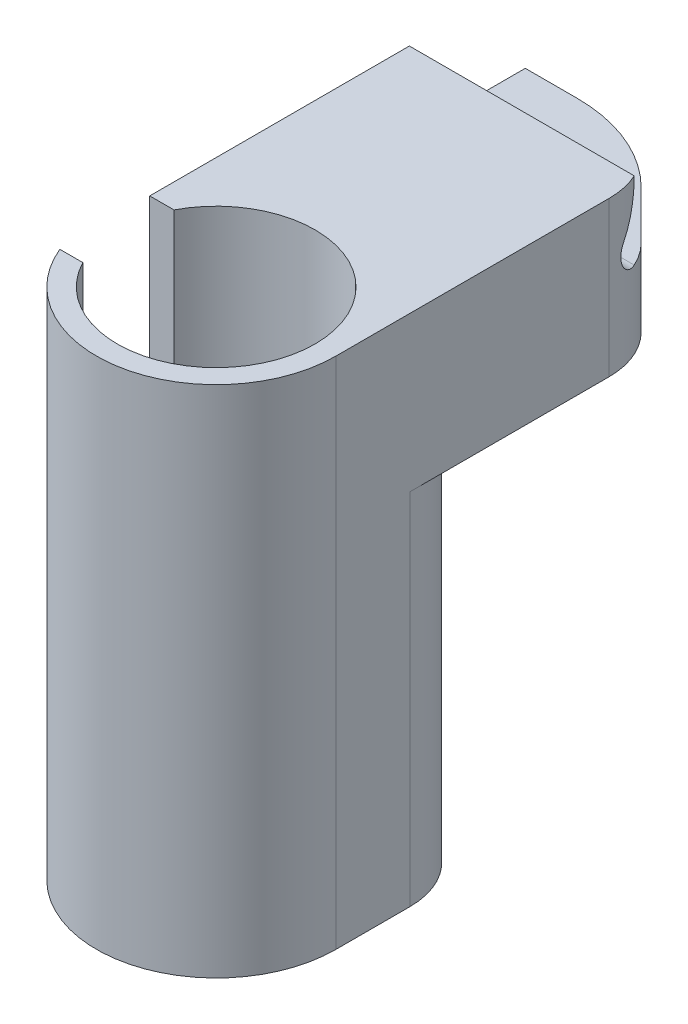
ISO-10303-21;
HEADER;
FILE_DESCRIPTION(('STEP AP214'),'2;1');
FILE_NAME('part.step','',(''),(''),'','','');
FILE_SCHEMA(('AUTOMOTIVE_DESIGN { 1 0 10303 214 1 1 1 1 }'));
ENDSEC;
DATA;
#1=APPLICATION_CONTEXT('core data for automotive mechanical design processes');
#2=APPLICATION_PROTOCOL_DEFINITION('international standard','automotive_design',2000,#1);
#3=PRODUCT_CONTEXT('',#1,'mechanical');
#4=PRODUCT('Part','Part','',(#3));
#5=PRODUCT_RELATED_PRODUCT_CATEGORY('part','',(#4));
#6=PRODUCT_DEFINITION_FORMATION('','',#4);
#7=PRODUCT_DEFINITION_CONTEXT('part definition',#1,'design');
#8=PRODUCT_DEFINITION('design','',#6,#7);
#9=PRODUCT_DEFINITION_SHAPE('','',#8);
#10=(LENGTH_UNIT() NAMED_UNIT(*) SI_UNIT(.MILLI.,.METRE.));
#11=(NAMED_UNIT(*) PLANE_ANGLE_UNIT() SI_UNIT($,.RADIAN.));
#12=(NAMED_UNIT(*) SI_UNIT($,.STERADIAN.) SOLID_ANGLE_UNIT());
#13=UNCERTAINTY_MEASURE_WITH_UNIT(LENGTH_MEASURE(1.E-05),#10,'distance_accuracy_value','');
#14=(GEOMETRIC_REPRESENTATION_CONTEXT(3) GLOBAL_UNCERTAINTY_ASSIGNED_CONTEXT((#13)) GLOBAL_UNIT_ASSIGNED_CONTEXT((#10,
#11,#12)) REPRESENTATION_CONTEXT('',''));
#15=CARTESIAN_POINT('',(0.,0.,0.));
#16=DIRECTION('',(0.,0.,1.));
#17=DIRECTION('',(1.,0.,0.));
#18=AXIS2_PLACEMENT_3D('',#15,#16,#17);
#19=CARTESIAN_POINT('',(-6.69669914110089,53.,-45.8884849389084));
#20=DIRECTION('',(0.,1.,0.));
#21=DIRECTION('',(0.,0.,1.));
#22=AXIS2_PLACEMENT_3D('',#19,#20,#21);
#23=PLANE('',#22);
#24=DIRECTION('',(-0.707106781186548,0.,-0.707106781186548));
#25=VECTOR('',#24,1.);
#26=CARTESIAN_POINT('',(0.500000000000012,53.,-54.5));
#27=LINE('',#26,#25);
#28=CARTESIAN_POINT('',(12.5710678118655,53.,-42.4289321881345));
#29=VERTEX_POINT('',#28);
#30=CARTESIAN_POINT('',(6.35786437626905,53.,-48.642135623731));
#31=VERTEX_POINT('',#30);
#32=EDGE_CURVE('E272',#29,#31,#27,.T.);
#33=ORIENTED_EDGE('',*,*,#32,.T.);
#34=CARTESIAN_POINT('',(-7.78427124746192,53.,-34.5));
#35=DIRECTION('',(0.,1.,0.));
#36=DIRECTION('',(-1.,0.,0.));
#37=AXIS2_PLACEMENT_3D('',#34,#35,#36);
#38=CIRCLE('',#37,20.);
#39=CARTESIAN_POINT('',(-7.78427124746192,53.,-54.5));
#40=VERTEX_POINT('',#39);
#41=EDGE_CURVE('E59',#31,#40,#38,.T.);
#42=ORIENTED_EDGE('',*,*,#41,.T.);
#43=DIRECTION('',(-1.,0.,0.));
#44=VECTOR('',#43,1.);
#45=CARTESIAN_POINT('',(-24.5,53.,-54.5));
#46=LINE('',#45,#44);
#47=CARTESIAN_POINT('',(-14.5,53.,-54.5));
#48=VERTEX_POINT('',#47);
#49=EDGE_CURVE('E231',#40,#48,#46,.T.);
#50=ORIENTED_EDGE('',*,*,#49,.T.);
#51=DIRECTION('',(0.,0.,-1.));
#52=VECTOR('',#51,1.);
#53=CARTESIAN_POINT('',(-14.5,53.,-19.5));
#54=LINE('',#53,#52);
#55=CARTESIAN_POINT('',(-14.5,53.,-39.5));
#56=VERTEX_POINT('',#55);
#57=EDGE_CURVE('E219',#56,#48,#54,.T.);
#58=ORIENTED_EDGE('',*,*,#57,.F.);
#59=DIRECTION('',(1.,0.,0.));
#60=VECTOR('',#59,1.);
#61=CARTESIAN_POINT('',(15.5,53.,-39.5));
#62=LINE('',#61,#60);
#63=CARTESIAN_POINT('',(14.6017972112446,53.,-39.5));
#64=VERTEX_POINT('',#63);
#65=EDGE_CURVE('E271',#56,#64,#62,.T.);
#66=ORIENTED_EDGE('',*,*,#65,.T.);
#67=CARTESIAN_POINT('',(5.5,53.,-35.357864376269));
#68=DIRECTION('',(0.,-1.,0.));
#69=DIRECTION('',(0.923879532511287,0.,-0.38268343236509));
#70=AXIS2_PLACEMENT_3D('',#67,#68,#69);
#71=CIRCLE('',#70,10.);
#72=EDGE_CURVE('E284',#29,#64,#71,.T.);
#73=ORIENTED_EDGE('',*,*,#72,.F.);
#74=EDGE_LOOP('',(#33,#42,#50,#58,#66,#73));
#75=FACE_BOUND('',#74,.T.);
#76=ADVANCED_FACE('F37',(#75),#23,.T.);
#77=CARTESIAN_POINT('',(0.500000000000007,43.,-54.5));
#78=DIRECTION('',(0.,0.,-1.));
#79=DIRECTION('',(-1.,0.,0.));
#80=AXIS2_PLACEMENT_3D('',#77,#78,#79);
#81=PLANE('',#80);
#82=ORIENTED_EDGE('',*,*,#49,.F.);
#83=DIRECTION('',(0.,1.,0.));
#84=VECTOR('',#83,1.);
#85=CARTESIAN_POINT('',(-7.78427124746193,43.,-54.5));
#86=LINE('',#85,#84);
#87=CARTESIAN_POINT('',(-7.78427124746193,43.,-54.5));
#88=VERTEX_POINT('',#87);
#89=EDGE_CURVE('E45',#40,#88,#86,.F.);
#90=ORIENTED_EDGE('',*,*,#89,.T.);
#91=DIRECTION('',(1.,0.,0.));
#92=VECTOR('',#91,1.);
#93=CARTESIAN_POINT('',(-24.5,43.,-54.5));
#94=LINE('',#93,#92);
#95=CARTESIAN_POINT('',(-14.5,43.,-54.5));
#96=VERTEX_POINT('',#95);
#97=EDGE_CURVE('E279',#96,#88,#94,.T.);
#98=ORIENTED_EDGE('',*,*,#97,.F.);
#99=DIRECTION('',(0.,-1.,0.));
#100=VECTOR('',#99,1.);
#101=CARTESIAN_POINT('',(-14.5,43.,-54.5));
#102=LINE('',#101,#100);
#103=EDGE_CURVE('E268',#48,#96,#102,.T.);
#104=ORIENTED_EDGE('',*,*,#103,.F.);
#105=EDGE_LOOP('',(#82,#90,#98,#104));
#106=FACE_BOUND('',#105,.T.);
#107=ADVANCED_FACE('F376',(#106),#81,.T.);
#108=CARTESIAN_POINT('',(15.5,-3.5,-19.5));
#109=DIRECTION('',(0.,1.,0.));
#110=DIRECTION('',(-1.,0.,0.));
#111=AXIS2_PLACEMENT_3D('',#108,#109,#110);
#112=PLANE('',#111);
#113=CARTESIAN_POINT('',(0.,-3.5,0.));
#114=DIRECTION('',(0.,1.,0.));
#115=DIRECTION('',(-1.,0.,0.));
#116=AXIS2_PLACEMENT_3D('',#113,#114,#115);
#117=CIRCLE('',#116,1.75);
#118=CARTESIAN_POINT('',(1.75,-3.5,0.));
#119=VERTEX_POINT('',#118);
#120=EDGE_CURVE('E228',#119,#119,#117,.T.);
#121=ORIENTED_EDGE('',*,*,#120,.T.);
#122=EDGE_LOOP('',(#121));
#123=FACE_BOUND('',#122,.T.);
#124=DIRECTION('',(-1.,0.,0.));
#125=VECTOR('',#124,1.);
#126=CARTESIAN_POINT('',(15.5,-3.5,-19.5));
#127=LINE('',#126,#125);
#128=CARTESIAN_POINT('',(5.6,-3.5,-19.5));
#129=VERTEX_POINT('',#128);
#130=CARTESIAN_POINT('',(-5.6,-3.5,-19.5));
#131=VERTEX_POINT('',#130);
#132=EDGE_CURVE('E275',#129,#131,#127,.T.);
#133=ORIENTED_EDGE('',*,*,#132,.F.);
#134=CARTESIAN_POINT('',(5.6,-3.5,-9.6));
#135=DIRECTION('',(0.,1.,0.));
#136=DIRECTION('',(-1.,0.,0.));
#137=AXIS2_PLACEMENT_3D('',#134,#135,#136);
#138=CIRCLE('',#137,9.9);
#139=CARTESIAN_POINT('',(15.5,-3.5,-9.6));
#140=VERTEX_POINT('',#139);
#141=EDGE_CURVE('E442',#129,#140,#138,.F.);
#142=ORIENTED_EDGE('',*,*,#141,.T.);
#143=DIRECTION('',(0.,0.,-1.));
#144=VECTOR('',#143,1.);
#145=CARTESIAN_POINT('',(15.5,-3.5,-9.75));
#146=LINE('',#145,#144);
#147=CARTESIAN_POINT('',(15.5,-3.5,0.));
#148=VERTEX_POINT('',#147);
#149=EDGE_CURVE('E255',#148,#140,#146,.T.);
#150=ORIENTED_EDGE('',*,*,#149,.F.);
#151=CARTESIAN_POINT('',(0.,-3.5,0.));
#152=DIRECTION('',(0.,1.,0.));
#153=DIRECTION('',(1.,0.,0.));
#154=AXIS2_PLACEMENT_3D('',#151,#152,#153);
#155=CIRCLE('',#154,15.5);
#156=CARTESIAN_POINT('',(-14.3331782937351,-3.5,5.9));
#157=VERTEX_POINT('',#156);
#158=EDGE_CURVE('E242',#157,#148,#155,.T.);
#159=ORIENTED_EDGE('',*,*,#158,.F.);
#160=DIRECTION('',(1.,0.,0.));
#161=VECTOR('',#160,1.);
#162=CARTESIAN_POINT('',(3.07043135440727,-3.5,5.9));
#163=LINE('',#162,#161);
#164=CARTESIAN_POINT('',(-9.35913729118545,-3.5,5.9));
#165=VERTEX_POINT('',#164);
#166=EDGE_CURVE('E232',#157,#165,#163,.T.);
#167=ORIENTED_EDGE('',*,*,#166,.T.);
#168=DIRECTION('',(0.,0.,-1.));
#169=VECTOR('',#168,1.);
#170=CARTESIAN_POINT('',(-9.35913729118545,-3.5,-12.7));
#171=LINE('',#170,#169);
#172=CARTESIAN_POINT('',(-9.35913729118545,-3.5,-5.9));
#173=VERTEX_POINT('',#172);
#174=EDGE_CURVE('E259',#165,#173,#171,.T.);
#175=ORIENTED_EDGE('',*,*,#174,.T.);
#176=DIRECTION('',(-1.,0.,0.));
#177=VECTOR('',#176,1.);
#178=CARTESIAN_POINT('',(-0.306475740290573,-3.5,-5.9));
#179=LINE('',#178,#177);
#180=CARTESIAN_POINT('',(-15.5,-3.5,-5.9));
#181=VERTEX_POINT('',#180);
#182=EDGE_CURVE('E256',#173,#181,#179,.T.);
#183=ORIENTED_EDGE('',*,*,#182,.T.);
#184=DIRECTION('',(0.,0.,1.));
#185=VECTOR('',#184,1.);
#186=CARTESIAN_POINT('',(-15.5,-3.5,-19.5));
#187=LINE('',#186,#185);
#188=CARTESIAN_POINT('',(-15.5,-3.5,-9.6));
#189=VERTEX_POINT('',#188);
#190=EDGE_CURVE('E299',#189,#181,#187,.T.);
#191=ORIENTED_EDGE('',*,*,#190,.F.);
#192=CARTESIAN_POINT('',(-5.6,-3.5,-9.6));
#193=DIRECTION('',(0.,1.,0.));
#194=DIRECTION('',(-1.,0.,0.));
#195=AXIS2_PLACEMENT_3D('',#192,#193,#194);
#196=CIRCLE('',#195,9.9);
#197=EDGE_CURVE('E440',#189,#131,#196,.F.);
#198=ORIENTED_EDGE('',*,*,#197,.T.);
#199=EDGE_LOOP('',(#133,#142,#150,#159,#167,#175,#183,#191,#198));
#200=FACE_BOUND('',#199,.T.);
#201=ADVANCED_FACE('F405',(#123,#200),#112,.F.);
#202=CARTESIAN_POINT('',(-9.35913729118545,63.,-5.9));
#203=DIRECTION('',(1.,0.,0.));
#204=DIRECTION('',(0.,0.,1.));
#205=AXIS2_PLACEMENT_3D('',#202,#203,#204);
#206=PLANE('',#205);
#207=DIRECTION('',(0.,0.,1.));
#208=VECTOR('',#207,1.);
#209=CARTESIAN_POINT('',(-9.35913729118545,0.,-5.88075955233941));
#210=LINE('',#209,#208);
#211=CARTESIAN_POINT('',(-9.35913729118545,0.,-5.9));
#212=VERTEX_POINT('',#211);
#213=CARTESIAN_POINT('',(-9.35913729118545,0.,5.9));
#214=VERTEX_POINT('',#213);
#215=EDGE_CURVE('E236',#212,#214,#210,.T.);
#216=ORIENTED_EDGE('',*,*,#215,.F.);
#217=DIRECTION('',(0.,-1.,0.));
#218=VECTOR('',#217,1.);
#219=CARTESIAN_POINT('',(-9.35913729118545,63.,-5.9));
#220=LINE('',#219,#218);
#221=EDGE_CURVE('E260',#212,#173,#220,.T.);
#222=ORIENTED_EDGE('',*,*,#221,.T.);
#223=ORIENTED_EDGE('',*,*,#174,.F.);
#224=DIRECTION('',(0.,-1.,0.));
#225=VECTOR('',#224,1.);
#226=CARTESIAN_POINT('',(-9.35913729118545,63.,5.9));
#227=LINE('',#226,#225);
#228=EDGE_CURVE('E264',#214,#165,#227,.T.);
#229=ORIENTED_EDGE('',*,*,#228,.F.);
#230=EDGE_LOOP('',(#216,#222,#223,#229));
#231=FACE_BOUND('',#230,.T.);
#232=ADVANCED_FACE('F493',(#231),#206,.F.);
#233=CARTESIAN_POINT('',(-9.35913729118545,63.,5.9));
#234=DIRECTION('',(0.,0.,1.));
#235=DIRECTION('',(-1.,0.,0.));
#236=AXIS2_PLACEMENT_3D('',#233,#234,#235);
#237=PLANE('',#236);
#238=DIRECTION('',(-1.,0.,0.));
#239=VECTOR('',#238,1.);
#240=CARTESIAN_POINT('',(-4.67956857817748,0.,5.9));
#241=LINE('',#240,#239);
#242=CARTESIAN_POINT('',(-11.3591372911854,0.,5.9));
#243=VERTEX_POINT('',#242);
#244=EDGE_CURVE('E233',#214,#243,#241,.T.);
#245=ORIENTED_EDGE('',*,*,#244,.F.);
#246=ORIENTED_EDGE('',*,*,#228,.T.);
#247=ORIENTED_EDGE('',*,*,#166,.F.);
#248=DIRECTION('',(0.,-1.,0.));
#249=VECTOR('',#248,1.);
#250=CARTESIAN_POINT('',(-14.3331782937351,0.,5.9));
#251=LINE('',#250,#249);
#252=CARTESIAN_POINT('',(-14.3331782937351,63.,5.9));
#253=VERTEX_POINT('',#252);
#254=EDGE_CURVE('E278',#253,#157,#251,.T.);
#255=ORIENTED_EDGE('',*,*,#254,.F.);
#256=DIRECTION('',(-1.,0.,0.));
#257=VECTOR('',#256,1.);
#258=CARTESIAN_POINT('',(-4.67956864559273,63.,5.9));
#259=LINE('',#258,#257);
#260=CARTESIAN_POINT('',(-11.3591372911854,63.,5.9));
#261=VERTEX_POINT('',#260);
#262=EDGE_CURVE('E267',#261,#253,#259,.T.);
#263=ORIENTED_EDGE('',*,*,#262,.F.);
#264=DIRECTION('',(0.,1.,0.));
#265=VECTOR('',#264,1.);
#266=CARTESIAN_POINT('',(-11.3591372911854,63.,5.9));
#267=LINE('',#266,#265);
#268=EDGE_CURVE('E303',#243,#261,#267,.T.);
#269=ORIENTED_EDGE('',*,*,#268,.F.);
#270=EDGE_LOOP('',(#245,#246,#247,#255,#263,#269));
#271=FACE_BOUND('',#270,.T.);
#272=ADVANCED_FACE('F495',(#271),#237,.F.);
#273=CARTESIAN_POINT('',(-16.1129514805811,63.,-5.9));
#274=DIRECTION('',(0.,0.,-1.));
#275=DIRECTION('',(1.,0.,0.));
#276=AXIS2_PLACEMENT_3D('',#273,#274,#275);
#277=PLANE('',#276);
#278=DIRECTION('',(1.,0.,0.));
#279=VECTOR('',#278,1.);
#280=CARTESIAN_POINT('',(-8.05647574029057,63.,-5.9));
#281=LINE('',#280,#279);
#282=CARTESIAN_POINT('',(-14.5,63.,-5.9));
#283=VERTEX_POINT('',#282);
#284=CARTESIAN_POINT('',(-11.3591372911854,63.,-5.9));
#285=VERTEX_POINT('',#284);
#286=EDGE_CURVE('E208',#283,#285,#281,.T.);
#287=ORIENTED_EDGE('',*,*,#286,.F.);
#288=DIRECTION('',(0.,-1.,0.));
#289=VECTOR('',#288,1.);
#290=CARTESIAN_POINT('',(-14.5,63.,-5.9));
#291=LINE('',#290,#289);
#292=CARTESIAN_POINT('',(-14.5,43.,-5.9));
#293=VERTEX_POINT('',#292);
#294=EDGE_CURVE('E196',#283,#293,#291,.T.);
#295=ORIENTED_EDGE('',*,*,#294,.T.);
#296=DIRECTION('',(-1.,0.,0.));
#297=VECTOR('',#296,1.);
#298=CARTESIAN_POINT('',(-16.1129514805811,43.,-5.9));
#299=LINE('',#298,#297);
#300=CARTESIAN_POINT('',(-15.5,43.,-5.9));
#301=VERTEX_POINT('',#300);
#302=EDGE_CURVE('E185',#293,#301,#299,.T.);
#303=ORIENTED_EDGE('',*,*,#302,.T.);
#304=DIRECTION('',(0.,1.,0.));
#305=VECTOR('',#304,1.);
#306=CARTESIAN_POINT('',(-15.5,31.5,-5.9));
#307=LINE('',#306,#305);
#308=EDGE_CURVE('E298',#181,#301,#307,.T.);
#309=ORIENTED_EDGE('',*,*,#308,.F.);
#310=ORIENTED_EDGE('',*,*,#182,.F.);
#311=ORIENTED_EDGE('',*,*,#221,.F.);
#312=DIRECTION('',(1.,0.,0.));
#313=VECTOR('',#312,1.);
#314=CARTESIAN_POINT('',(-8.05647567287533,0.,-5.9));
#315=LINE('',#314,#313);
#316=CARTESIAN_POINT('',(-11.3591372911854,0.,-5.9));
#317=VERTEX_POINT('',#316);
#318=EDGE_CURVE('E310',#317,#212,#315,.T.);
#319=ORIENTED_EDGE('',*,*,#318,.F.);
#320=DIRECTION('',(0.,-1.,0.));
#321=VECTOR('',#320,1.);
#322=CARTESIAN_POINT('',(-11.3591372911854,63.,-5.9));
#323=LINE('',#322,#321);
#324=EDGE_CURVE('E290',#285,#317,#323,.T.);
#325=ORIENTED_EDGE('',*,*,#324,.F.);
#326=EDGE_LOOP('',(#287,#295,#303,#309,#310,#311,#319,#325));
#327=FACE_BOUND('',#326,.T.);
#328=ADVANCED_FACE('F206',(#327),#277,.F.);
#329=CARTESIAN_POINT('',(-15.5,0.,-19.5));
#330=DIRECTION('',(-1.,0.,0.));
#331=DIRECTION('',(0.,0.,1.));
#332=AXIS2_PLACEMENT_3D('',#329,#330,#331);
#333=PLANE('',#332);
#334=ORIENTED_EDGE('',*,*,#308,.T.);
#335=DIRECTION('',(0.,0.,-1.));
#336=VECTOR('',#335,1.);
#337=CARTESIAN_POINT('',(-15.5,43.,-19.5));
#338=LINE('',#337,#336);
#339=CARTESIAN_POINT('',(-15.5,43.,-9.6));
#340=VERTEX_POINT('',#339);
#341=EDGE_CURVE('E191',#301,#340,#338,.T.);
#342=ORIENTED_EDGE('',*,*,#341,.T.);
#343=DIRECTION('',(0.,-1.,0.));
#344=VECTOR('',#343,1.);
#345=CARTESIAN_POINT('',(-15.5,0.,-9.6));
#346=LINE('',#345,#344);
#347=EDGE_CURVE('E447',#340,#189,#346,.T.);
#348=ORIENTED_EDGE('',*,*,#347,.T.);
#349=ORIENTED_EDGE('',*,*,#190,.T.);
#350=EDGE_LOOP('',(#334,#342,#348,#349));
#351=FACE_BOUND('',#350,.T.);
#352=ADVANCED_FACE('F374',(#351),#333,.T.);
#353=CARTESIAN_POINT('',(1.3483048785447E-07,0.,-5.86151910467881));
#354=DIRECTION('',(0.,1.,0.));
#355=DIRECTION('',(0.,0.,1.));
#356=AXIS2_PLACEMENT_3D('',#353,#354,#355);
#357=PLANE('',#356);
#358=CARTESIAN_POINT('',(0.,0.,0.));
#359=DIRECTION('',(0.,1.,0.));
#360=DIRECTION('',(-1.,0.,0.));
#361=AXIS2_PLACEMENT_3D('',#358,#359,#360);
#362=CIRCLE('',#361,4.75);
#363=CARTESIAN_POINT('',(4.75,0.,0.));
#364=VERTEX_POINT('',#363);
#365=EDGE_CURVE('E245',#364,#364,#362,.T.);
#366=ORIENTED_EDGE('',*,*,#365,.F.);
#367=EDGE_LOOP('',(#366));
#368=FACE_BOUND('',#367,.T.);
#369=CARTESIAN_POINT('',(0.,0.,0.));
#370=DIRECTION('',(0.,-1.,0.));
#371=DIRECTION('',(-1.,0.,0.));
#372=AXIS2_PLACEMENT_3D('',#369,#370,#371);
#373=CIRCLE('',#372,12.8);
#374=EDGE_CURVE('E251',#317,#243,#373,.T.);
#375=ORIENTED_EDGE('',*,*,#374,.F.);
#376=ORIENTED_EDGE('',*,*,#318,.T.);
#377=ORIENTED_EDGE('',*,*,#215,.T.);
#378=ORIENTED_EDGE('',*,*,#244,.T.);
#379=EDGE_LOOP('',(#375,#376,#377,#378));
#380=FACE_BOUND('',#379,.T.);
#381=ADVANCED_FACE('F410',(#368,#380),#357,.T.);
#382=CARTESIAN_POINT('',(0.,63.,0.));
#383=DIRECTION('',(0.,1.,0.));
#384=DIRECTION('',(0.,0.,1.));
#385=AXIS2_PLACEMENT_3D('',#382,#383,#384);
#386=PLANE('',#385);
#387=DIRECTION('',(0.,0.,-1.));
#388=VECTOR('',#387,1.);
#389=CARTESIAN_POINT('',(-14.5,63.,0.));
#390=LINE('',#389,#388);
#391=CARTESIAN_POINT('',(-14.5,63.,-39.5));
#392=VERTEX_POINT('',#391);
#393=EDGE_CURVE('E217',#283,#392,#390,.T.);
#394=ORIENTED_EDGE('',*,*,#393,.F.);
#395=ORIENTED_EDGE('',*,*,#286,.T.);
#396=CARTESIAN_POINT('',(0.,63.,0.));
#397=DIRECTION('',(0.,-1.,0.));
#398=DIRECTION('',(-1.,0.,0.));
#399=AXIS2_PLACEMENT_3D('',#396,#397,#398);
#400=CIRCLE('',#399,12.8);
#401=EDGE_CURVE('E265',#285,#261,#400,.T.);
#402=ORIENTED_EDGE('',*,*,#401,.T.);
#403=ORIENTED_EDGE('',*,*,#262,.T.);
#404=CARTESIAN_POINT('',(0.,63.,0.));
#405=DIRECTION('',(0.,1.,0.));
#406=DIRECTION('',(1.,0.,0.));
#407=AXIS2_PLACEMENT_3D('',#404,#405,#406);
#408=CIRCLE('',#407,15.5);
#409=CARTESIAN_POINT('',(15.5,63.,0.));
#410=VERTEX_POINT('',#409);
#411=EDGE_CURVE('E240',#253,#410,#408,.T.);
#412=ORIENTED_EDGE('',*,*,#411,.T.);
#413=DIRECTION('',(0.,0.,1.));
#414=VECTOR('',#413,1.);
#415=CARTESIAN_POINT('',(15.5,63.,-4.875));
#416=LINE('',#415,#414);
#417=CARTESIAN_POINT('',(15.5,63.,-35.3578643762691));
#418=VERTEX_POINT('',#417);
#419=EDGE_CURVE('E287',#418,#410,#416,.T.);
#420=ORIENTED_EDGE('',*,*,#419,.F.);
#421=CARTESIAN_POINT('',(5.5,63.,-35.3578643762691));
#422=DIRECTION('',(0.,-1.,0.));
#423=DIRECTION('',(0.,0.,-1.));
#424=AXIS2_PLACEMENT_3D('',#421,#422,#423);
#425=CIRCLE('',#424,10.);
#426=CARTESIAN_POINT('',(14.6017972112446,63.,-39.5));
#427=VERTEX_POINT('',#426);
#428=EDGE_CURVE('E222',#418,#427,#425,.F.);
#429=ORIENTED_EDGE('',*,*,#428,.T.);
#430=DIRECTION('',(1.,0.,0.));
#431=VECTOR('',#430,1.);
#432=CARTESIAN_POINT('',(7.75,63.,-39.5));
#433=LINE('',#432,#431);
#434=EDGE_CURVE('E307',#392,#427,#433,.T.);
#435=ORIENTED_EDGE('',*,*,#434,.F.);
#436=EDGE_LOOP('',(#394,#395,#402,#403,#412,#420,#429,#435));
#437=FACE_BOUND('',#436,.T.);
#438=ADVANCED_FACE('F373',(#437),#386,.T.);
#439=CARTESIAN_POINT('',(5.5,21.5,-35.357864376269));
#440=DIRECTION('',(0.,1.,0.));
#441=DIRECTION('',(0.923879532511287,0.,-0.38268343236509));
#442=AXIS2_PLACEMENT_3D('',#439,#440,#441);
#443=CYLINDRICAL_SURFACE('',#442,10.);
#444=ORIENTED_EDGE('',*,*,#428,.F.);
#445=DIRECTION('',(0.,-1.,0.));
#446=VECTOR('',#445,1.);
#447=CARTESIAN_POINT('',(15.5,21.5,-35.357864376269));
#448=LINE('',#447,#446);
#449=CARTESIAN_POINT('',(15.5,43.,-35.357864376269));
#450=VERTEX_POINT('',#449);
#451=EDGE_CURVE('E304',#418,#450,#448,.T.);
#452=ORIENTED_EDGE('',*,*,#451,.T.);
#453=CARTESIAN_POINT('',(5.5,43.,-35.357864376269));
#454=DIRECTION('',(0.,1.,0.));
#455=DIRECTION('',(0.923879532511287,0.,-0.38268343236509));
#456=AXIS2_PLACEMENT_3D('',#453,#454,#455);
#457=CIRCLE('',#456,10.);
#458=CARTESIAN_POINT('',(12.5710678118655,43.,-42.4289321881345));
#459=VERTEX_POINT('',#458);
#460=EDGE_CURVE('E237',#450,#459,#457,.T.);
#461=ORIENTED_EDGE('',*,*,#460,.T.);
#462=DIRECTION('',(0.,1.,0.));
#463=VECTOR('',#462,1.);
#464=CARTESIAN_POINT('',(12.5710678118655,21.5,-42.4289321881345));
#465=LINE('',#464,#463);
#466=EDGE_CURVE('E241',#459,#29,#465,.T.);
#467=ORIENTED_EDGE('',*,*,#466,.T.);
#468=ORIENTED_EDGE('',*,*,#72,.T.);
#469=CARTESIAN_POINT('',(14.6017972112446,53.,-39.5));
#470=CARTESIAN_POINT('',(14.6176212411413,52.9999978917598,-39.4652300732399));
#471=CARTESIAN_POINT('',(14.6332455586687,53.0007664956833,-39.4303679797023));
#472=CARTESIAN_POINT('',(14.6641278876404,53.0038274391226,-39.3603917303604));
#473=CARTESIAN_POINT('',(14.6793843039476,53.006125487402,-39.3252771196057));
#474=CARTESIAN_POINT('',(14.7019142746531,53.0106987360047,-39.2725978129884));
#475=CARTESIAN_POINT('',(14.7093576960573,53.0124085173464,-39.2550548251874));
#476=CARTESIAN_POINT('',(14.7241522877597,53.016206282941,-39.2199077606057));
#477=CARTESIAN_POINT('',(14.7315031122547,53.0182953919438,-39.2023036591127));
#478=CARTESIAN_POINT('',(14.7466757977762,53.0230204634832,-39.1656735559264));
#479=CARTESIAN_POINT('',(14.7544878210296,53.02568694542,-39.1466474102708));
#480=CARTESIAN_POINT('',(14.7699192308562,53.0314252126855,-39.1087327529513));
#481=CARTESIAN_POINT('',(14.7775395682694,53.0344941076967,-39.0898441881617));
#482=CARTESIAN_POINT('',(14.7999600858733,53.044243652523,-39.0337786444086));
#483=CARTESIAN_POINT('',(14.8145582390162,53.0515412593099,-38.9966257030359));
#484=CARTESIAN_POINT('',(14.8430263078906,53.0677539216499,-38.9228894890018));
#485=CARTESIAN_POINT('',(14.8569025235211,53.0766500577906,-38.8863044802297));
#486=CARTESIAN_POINT('',(14.8839522771332,53.0960575709543,-38.8137181862423));
#487=CARTESIAN_POINT('',(14.8971311936339,53.1065529808633,-38.7777146465478));
#488=CARTESIAN_POINT('',(14.9228109134488,53.1291558067433,-38.7063062959111));
#489=CARTESIAN_POINT('',(14.9353160863289,53.1412504499514,-38.6708990167389));
#490=CARTESIAN_POINT('',(14.9596729349199,53.167048492586,-38.6006965686808));
#491=CARTESIAN_POINT('',(14.9715278854315,53.1807424786117,-38.565899079258));
#492=CARTESIAN_POINT('',(14.9946086275692,53.2097357380225,-38.4969286788977));
#493=CARTESIAN_POINT('',(15.0058365334793,53.2250290456475,-38.4627539684233));
#494=CARTESIAN_POINT('',(15.0276873248984,53.2572175134019,-38.3950403597593));
#495=CARTESIAN_POINT('',(15.0383111201746,53.2741101569237,-38.3615005591314));
#496=CARTESIAN_POINT('',(15.0589774112073,53.3094935814802,-38.2950674228111));
#497=CARTESIAN_POINT('',(15.0690195943668,53.3279852088465,-38.2621744409207));
#498=CARTESIAN_POINT('',(15.0897495339624,53.3689409358158,-38.1930302249717));
#499=CARTESIAN_POINT('',(15.1003592232711,53.39161200126,-38.1568780069184));
#500=CARTESIAN_POINT('',(15.120908254773,53.4389605460364,-38.0854117543039));
#501=CARTESIAN_POINT('',(15.1308435780688,53.4636483994933,-38.0501034407036));
#502=CARTESIAN_POINT('',(15.1479649523764,53.5093834678541,-37.9879932392403));
#503=CARTESIAN_POINT('',(15.1552867590256,53.5300903320875,-37.9609773449668));
#504=CARTESIAN_POINT('',(15.1694217326506,53.5724164857768,-37.9079680513829));
#505=CARTESIAN_POINT('',(15.1762390577921,53.594025284698,-37.8819673946524));
#506=CARTESIAN_POINT('',(15.1903046180155,53.64121873963,-37.827457174356));
#507=CARTESIAN_POINT('',(15.1974930998254,53.6669543820032,-37.7990626353956));
#508=CARTESIAN_POINT('',(15.2112797860348,53.7196077520659,-37.743625315467));
#509=CARTESIAN_POINT('',(15.2178817136155,53.7465161215255,-37.7165745738753));
#510=CARTESIAN_POINT('',(15.2305313356387,53.8015118259423,-37.663833147368));
#511=CARTESIAN_POINT('',(15.2365814700263,53.8295930808957,-37.6381367106993));
#512=CARTESIAN_POINT('',(15.2481617353498,53.8869311706942,-37.5881111055208));
#513=CARTESIAN_POINT('',(15.2536930641895,53.9161850630742,-37.5637788422416));
#514=CARTESIAN_POINT('',(15.2642682274889,53.9758652856621,-37.5164873447263));
#515=CARTESIAN_POINT('',(15.2693120806922,54.0062915707281,-37.4935280577117));
#516=CARTESIAN_POINT('',(15.2789430089916,54.0683137779833,-37.4489870570369));
#517=CARTESIAN_POINT('',(15.2835290077787,54.0999122273177,-37.4274086302755));
#518=CARTESIAN_POINT('',(15.2922730880968,54.1642759809398,-37.3856329384017));
#519=CARTESIAN_POINT('',(15.2964291004665,54.1970459910346,-37.3654424956729));
#520=CARTESIAN_POINT('',(15.3043403028207,54.2637517927613,-37.3264450589376));
#521=CARTESIAN_POINT('',(15.3080925476846,54.2976940393525,-37.3076485051759));
#522=CARTESIAN_POINT('',(15.3143174030566,54.3579863959907,-37.2760316661723));
#523=CARTESIAN_POINT('',(15.3168779315409,54.3841533217094,-37.2628775627461));
#524=CARTESIAN_POINT('',(15.3217977623506,54.4371408133959,-37.2373481183391));
#525=CARTESIAN_POINT('',(15.3241553137537,54.4639649114671,-37.224979756379));
#526=CARTESIAN_POINT('',(15.327930826464,54.5092859885831,-37.2049818688349));
#527=CARTESIAN_POINT('',(15.3294062501052,54.5276731039644,-37.1971124361864));
#528=CARTESIAN_POINT('',(15.3336480966625,54.5825814302607,-37.174344870008));
#529=CARTESIAN_POINT('',(15.3362760982638,54.6193647668746,-37.1600461668467));
#530=CARTESIAN_POINT('',(15.3411418797461,54.6932225433863,-37.1332825820796));
#531=CARTESIAN_POINT('',(15.3433831120683,54.7302909488664,-37.1208016499138));
#532=CARTESIAN_POINT('',(15.3474972474713,54.804718489142,-37.0976732642707));
#533=CARTESIAN_POINT('',(15.3493727252,54.8420735131398,-37.0870130655308));
#534=CARTESIAN_POINT('',(15.3527739028713,54.9170718815202,-37.0675262732358));
#535=CARTESIAN_POINT('',(15.3543013314418,54.9547127969212,-37.0586906392531));
#536=CARTESIAN_POINT('',(15.3570219783784,55.0302814113118,-37.0428516604274));
#537=CARTESIAN_POINT('',(15.3582161108521,55.0682080269968,-37.0358433075817));
#538=CARTESIAN_POINT('',(15.3602826432477,55.1443467197997,-37.0236568014561));
#539=CARTESIAN_POINT('',(15.3611551766931,55.1825586717114,-37.0184778886542));
#540=CARTESIAN_POINT('',(15.3625879129716,55.2592671034812,-37.0099474290743));
#541=CARTESIAN_POINT('',(15.3631475033353,55.2977639929136,-37.0065994659779));
#542=CARTESIAN_POINT('',(15.3639606856353,55.3750420170382,-37.0017274249307));
#543=CARTESIAN_POINT('',(15.3642129531806,55.4138236624398,-37.0002112411647));
#544=CARTESIAN_POINT('',(15.3644146880206,55.4916705150551,-36.9989991078475));
#545=CARTESIAN_POINT('',(15.3643621507399,55.5307359080898,-36.9993152084617));
#546=CARTESIAN_POINT('',(15.3639545836603,55.6091531758583,-37.0017626622349));
#547=CARTESIAN_POINT('',(15.3635968992384,55.6485045507149,-37.003909945679));
#548=CARTESIAN_POINT('',(15.3628975107627,55.7025875528258,-37.0080928207659));
#549=CARTESIAN_POINT('',(15.3626846869213,55.7173834023816,-37.0093645239932));
#550=CARTESIAN_POINT('',(15.3622161945655,55.7470155778311,-37.0121599294019));
#551=CARTESIAN_POINT('',(15.3619603440885,55.7618518006489,-37.0136847014545));
#552=CARTESIAN_POINT('',(15.3612222187983,55.8011984289647,-37.018076446125));
#553=CARTESIAN_POINT('',(15.360701367054,55.8256834780218,-37.0211686071465));
#554=CARTESIAN_POINT('',(15.3595326776,55.8745021245123,-37.0280821903874));
#555=CARTESIAN_POINT('',(15.3588850677078,55.8988359140172,-37.0319023039646));
#556=CARTESIAN_POINT('',(15.357035911634,55.9618568552219,-37.0427647688111));
#557=CARTESIAN_POINT('',(15.35573439675,56.0004457311031,-37.0503697782523));
#558=CARTESIAN_POINT('',(15.3527905677484,56.0772384874483,-37.0674236008557));
#559=CARTESIAN_POINT('',(15.3511479206209,56.1154419531796,-37.0768742151366));
#560=CARTESIAN_POINT('',(15.3471646906495,56.1986144075708,-37.0995603077106));
#561=CARTESIAN_POINT('',(15.3447506857592,56.2434771930167,-37.1131740287465));
#562=CARTESIAN_POINT('',(15.3393900574832,56.3326656833787,-37.142978880023));
#563=CARTESIAN_POINT('',(15.3364397224472,56.3769851910192,-37.1591878711499));
#564=CARTESIAN_POINT('',(15.3310043432759,56.4510480639997,-37.1885752961039));
#565=CARTESIAN_POINT('',(15.3286587601935,56.4810492822178,-37.2011346230063));
#566=CARTESIAN_POINT('',(15.3237185287323,56.540341090925,-37.2272841114058));
#567=CARTESIAN_POINT('',(15.3211256279571,56.5696350664997,-37.2408669154768));
#568=CARTESIAN_POINT('',(15.3150536862059,56.6341392943323,-37.2722915345771));
#569=CARTESIAN_POINT('',(15.3115060516519,56.669210179741,-37.29040716205));
#570=CARTESIAN_POINT('',(15.3039886302202,56.7382743144609,-37.3281882795552));
#571=CARTESIAN_POINT('',(15.3000206103116,56.7722713512976,-37.3478471990307));
#572=CARTESIAN_POINT('',(15.2916350596834,56.8391893754682,-37.3887058607035));
#573=CARTESIAN_POINT('',(15.2872183065853,56.872112097953,-37.4099029197931));
#574=CARTESIAN_POINT('',(15.2779066775837,56.9368858409136,-37.4538234644996));
#575=CARTESIAN_POINT('',(15.2730114837879,56.9687361296742,-37.4765479618243));
#576=CARTESIAN_POINT('',(15.2678684967368,57.,-37.5));
#577=B_SPLINE_CURVE_WITH_KNOTS('',3,(#469,#470,#471,#472,#473,#474,#475,#476,#477,#478,#479,
#480,#481,#482,#483,#484,#485,#486,#487,#488,#489,#490,#491,#492,#493,#494,#495,#496,#497,#498,
#499,#500,#501,#502,#503,#504,#505,#506,#507,#508,#509,#510,#511,#512,#513,#514,#515,#516,#517,
#518,#519,#520,#521,#522,#523,#524,#525,#526,#527,#528,#529,#530,#531,#532,#533,#534,#535,#536,
#537,#538,#539,#540,#541,#542,#543,#544,#545,#546,#547,#548,#549,#550,#551,#552,#553,#554,#555,
#556,#557,#558,#559,#560,#561,#562,#563,#564,#565,#566,#567,#568,#569,#570,#571,#572,#573,#574,
#575,#576),.UNSPECIFIED.,.F.,.F.,(4,2,2,2,2,2,2,2,2,2,2,2,2,2,2,2,2,2,2,2,2,2,2,2,2,2,2,2,2,2,2,
2,2,2,2,2,2,2,2,2,2,2,2,2,2,2,2,2,2,2,2,2,2,4),(0.,0.114598612591368,0.229627390006032,
0.287024056097341,0.344593774783252,0.406807618943774,0.46859686553013,0.590293218548096,
0.71063418847676,0.82984410268967,0.9481537226641,1.06579910790755,1.18302033101984,
1.30006007488488,1.41716215080807,1.54901782469934,1.68160055483189,1.786025416472,
1.88946194641645,2.00638821539587,2.12250947592435,2.23808947385965,2.35339566986691,
2.46869743055043,2.5842641540396,2.70036339448787,2.81725905003026,2.90543948889369,
2.9943170760274,3.05447741296323,3.17308749539215,3.29057687516991,3.40720673394382,
3.52324405796631,3.63895993539355,3.75462771486553,3.87052108563283,3.98691214574017,
4.10406952574162,4.22225663096813,4.26681089097279,4.31155854403088,4.38560139643927,
4.4595123765341,4.57752029874214,4.69564396517718,4.83640022790761,4.97817048397688,
5.0759738758301,5.17313120681167,5.29198091091152,5.41034952087985,5.52851639659771,
5.64676232718834),.UNSPECIFIED.);
#578=CARTESIAN_POINT('',(15.2678684967368,57.,-37.5));
#579=VERTEX_POINT('',#578);
#580=EDGE_CURVE('E391',#64,#579,#577,.T.);
#581=ORIENTED_EDGE('',*,*,#580,.T.);
#582=CARTESIAN_POINT('',(15.2678684967368,57.,-37.5));
#583=CARTESIAN_POINT('',(15.250345917385,57.1065170107118,-37.579895780076));
#584=CARTESIAN_POINT('',(15.2322824240931,57.2145965743681,-37.6575830856732));
#585=CARTESIAN_POINT('',(15.1953691193452,57.4338136236712,-37.808551493999));
#586=CARTESIAN_POINT('',(15.1765185828048,57.5449538954985,-37.8818283747171));
#587=CARTESIAN_POINT('',(15.138315384407,57.7702922877794,-38.0240052753042));
#588=CARTESIAN_POINT('',(15.1189616316686,57.8844970723118,-38.0928944333725));
#589=CARTESIAN_POINT('',(15.0800125353717,58.1159553143463,-38.2263502701182));
#590=CARTESIAN_POINT('',(15.0604165521412,58.2332187330053,-38.2908994723115));
#591=CARTESIAN_POINT('',(15.0208089664297,58.4733913503172,-38.4170605510802));
#592=CARTESIAN_POINT('',(15.0008004309652,58.5963674965077,-38.4785460308666));
#593=CARTESIAN_POINT('',(14.9614657266688,58.8435405682729,-38.5958352926219));
#594=CARTESIAN_POINT('',(14.9421346769057,58.9677122137017,-38.6516906710173));
#595=CARTESIAN_POINT('',(14.9044395031624,59.2172659392567,-38.7578144389642));
#596=CARTESIAN_POINT('',(14.8860684265127,59.3426280708913,-38.808127233846));
#597=CARTESIAN_POINT('',(14.8505543837053,59.5945614587452,-38.9032405733829));
#598=CARTESIAN_POINT('',(14.8334036083522,59.7211177621163,-38.9480777966176));
#599=CARTESIAN_POINT('',(14.8002841877922,59.9774360857697,-39.0330263329888));
#600=CARTESIAN_POINT('',(14.7843295916339,60.1072177193072,-39.0730840153389));
#601=CARTESIAN_POINT('',(14.758651736351,60.3285362869796,-39.1365086985306));
#602=CARTESIAN_POINT('',(14.7485144195429,60.4196377803254,-39.1612348487469));
#603=CARTESIAN_POINT('',(14.7345496295263,60.5510605091453,-39.1949486640587));
#604=CARTESIAN_POINT('',(14.7303837432153,60.5910864242206,-39.2049577439755));
#605=CARTESIAN_POINT('',(14.7130212522269,60.7615757468039,-39.2464922838227));
#606=CARTESIAN_POINT('',(14.7006167268237,60.8926948174924,-39.2757068262782));
#607=CARTESIAN_POINT('',(14.6778724377726,61.1551473779638,-39.3286933020938));
#608=CARTESIAN_POINT('',(14.66751757561,61.286471519608,-39.3525052390563));
#609=CARTESIAN_POINT('',(14.6489934730685,61.5493375870896,-39.3947503303886));
#610=CARTESIAN_POINT('',(14.6408116682267,61.6808736310981,-39.4132144641744));
#611=CARTESIAN_POINT('',(14.6267264396634,61.9441580258535,-39.4448144238752));
#612=CARTESIAN_POINT('',(14.6208138211957,62.0759033003204,-39.4579717642127));
#613=CARTESIAN_POINT('',(14.611334067411,62.3396041207338,-39.478996756957));
#614=CARTESIAN_POINT('',(14.6077617348519,62.4715585439196,-39.4868761314063));
#615=CARTESIAN_POINT('',(14.6029896303904,62.7356751673369,-39.4973793781988));
#616=CARTESIAN_POINT('',(14.6017890709592,62.8678372840128,-39.5000049950151));
#617=CARTESIAN_POINT('',(14.6017972112445,63.,-39.5));
#618=B_SPLINE_CURVE_WITH_KNOTS('',3,(#582,#583,#584,#585,#586,#587,#588,#589,#590,#591,#592,
#593,#594,#595,#596,#597,#598,#599,#600,#601,#602,#603,#604,#605,#606,#607,#608,#609,#610,#611,
#612,#613,#614,#615,#616,#617),.UNSPECIFIED.,.F.,.F.,(4,2,2,2,2,2,2,2,2,2,2,2,2,2,2,2,2,4),(0.,
0.402863421528478,0.806106555488926,1.21031195090683,1.61605802224761,2.03276129861197,
2.44521043085106,2.85406891213082,3.2600178610766,3.67016224515803,3.95494117289824,
4.07934418650659,4.48392768387047,4.88540985245457,5.28451748789881,5.68199042085154,
6.07857763740931,6.4750331481139),.UNSPECIFIED.);
#619=EDGE_CURVE('E306',#579,#427,#618,.T.);
#620=ORIENTED_EDGE('',*,*,#619,.T.);
#621=EDGE_LOOP('',(#444,#452,#461,#467,#468,#581,#620));
#622=FACE_BOUND('',#621,.T.);
#623=ADVANCED_FACE('F362',(#622),#443,.T.);
#624=CARTESIAN_POINT('',(7.75,63.,-29.5));
#625=DIRECTION('',(1.,0.,0.));
#626=DIRECTION('',(0.,-0.707106781186547,-0.707106781186548));
#627=AXIS2_PLACEMENT_3D('',#624,#625,#626);
#628=CYLINDRICAL_SURFACE('',#627,10.);
#629=CARTESIAN_POINT('',(-14.5,63.,-29.5));
#630=DIRECTION('',(1.,0.,0.));
#631=DIRECTION('',(0.,0.,-1.));
#632=AXIS2_PLACEMENT_3D('',#629,#630,#631);
#633=CIRCLE('',#632,10.);
#634=CARTESIAN_POINT('',(-14.5,57.,-37.5));
#635=VERTEX_POINT('',#634);
#636=EDGE_CURVE('E212',#392,#635,#633,.F.);
#637=ORIENTED_EDGE('',*,*,#636,.F.);
#638=ORIENTED_EDGE('',*,*,#434,.T.);
#639=ORIENTED_EDGE('',*,*,#619,.F.);
#640=DIRECTION('',(1.,0.,0.));
#641=VECTOR('',#640,1.);
#642=CARTESIAN_POINT('',(7.75,57.,-37.5));
#643=LINE('',#642,#641);
#644=EDGE_CURVE('E294',#635,#579,#643,.T.);
#645=ORIENTED_EDGE('',*,*,#644,.F.);
#646=EDGE_LOOP('',(#637,#638,#639,#645));
#647=FACE_BOUND('',#646,.T.);
#648=ADVANCED_FACE('F372',(#647),#628,.T.);
#649=CARTESIAN_POINT('',(7.75,55.5,-39.5));
#650=DIRECTION('',(-1.,0.,0.));
#651=DIRECTION('',(0.,-0.447213595499958,0.894427190999916));
#652=AXIS2_PLACEMENT_3D('',#649,#650,#651);
#653=CYLINDRICAL_SURFACE('',#652,2.5);
#654=ORIENTED_EDGE('',*,*,#65,.F.);
#655=CARTESIAN_POINT('',(-14.5,55.5,-39.5));
#656=DIRECTION('',(1.,0.,0.));
#657=DIRECTION('',(0.,0.,-1.));
#658=AXIS2_PLACEMENT_3D('',#655,#656,#657);
#659=CIRCLE('',#658,2.5);
#660=EDGE_CURVE('E209',#56,#635,#659,.F.);
#661=ORIENTED_EDGE('',*,*,#660,.T.);
#662=ORIENTED_EDGE('',*,*,#644,.T.);
#663=ORIENTED_EDGE('',*,*,#580,.F.);
#664=EDGE_LOOP('',(#654,#661,#662,#663));
#665=FACE_BOUND('',#664,.T.);
#666=ADVANCED_FACE('F395',(#665),#653,.F.);
#667=CARTESIAN_POINT('',(15.5,43.,-39.5));
#668=DIRECTION('',(0.707106781186548,0.,-0.707106781186548));
#669=DIRECTION('',(-0.707106781186548,0.,-0.707106781186548));
#670=AXIS2_PLACEMENT_3D('',#667,#668,#669);
#671=PLANE('',#670);
#672=DIRECTION('',(0.707106781186548,0.,0.707106781186548));
#673=VECTOR('',#672,1.);
#674=CARTESIAN_POINT('',(0.500000000000007,43.,-54.5));
#675=LINE('',#674,#673);
#676=CARTESIAN_POINT('',(6.35786437626905,43.,-48.642135623731));
#677=VERTEX_POINT('',#676);
#678=EDGE_CURVE('E250',#677,#459,#675,.T.);
#679=ORIENTED_EDGE('',*,*,#678,.F.);
#680=DIRECTION('',(0.,1.,0.));
#681=VECTOR('',#680,1.);
#682=CARTESIAN_POINT('',(6.35786437626903,43.,-48.642135623731));
#683=LINE('',#682,#681);
#684=EDGE_CURVE('E455',#677,#31,#683,.T.);
#685=ORIENTED_EDGE('',*,*,#684,.T.);
#686=ORIENTED_EDGE('',*,*,#32,.F.);
#687=ORIENTED_EDGE('',*,*,#466,.F.);
#688=EDGE_LOOP('',(#679,#685,#686,#687));
#689=FACE_BOUND('',#688,.T.);
#690=ADVANCED_FACE('F404',(#689),#671,.T.);
#691=CARTESIAN_POINT('',(0.,-3.,0.));
#692=DIRECTION('',(0.,-1.,0.));
#693=DIRECTION('',(0.,0.,-1.));
#694=AXIS2_PLACEMENT_3D('',#691,#692,#693);
#695=TOROIDAL_SURFACE('',#694,4.75,3.);
#696=CARTESIAN_POINT('',(0.,-3.,0.));
#697=DIRECTION('',(0.,-1.,0.));
#698=DIRECTION('',(-1.,0.,0.));
#699=AXIS2_PLACEMENT_3D('',#696,#697,#698);
#700=CIRCLE('',#699,1.75);
#701=CARTESIAN_POINT('',(1.75,-3.,0.));
#702=VERTEX_POINT('',#701);
#703=EDGE_CURVE('E291',#702,#702,#700,.T.);
#704=ORIENTED_EDGE('',*,*,#703,.T.);
#705=EDGE_LOOP('',(#704));
#706=FACE_BOUND('',#705,.T.);
#707=ORIENTED_EDGE('',*,*,#365,.T.);
#708=EDGE_LOOP('',(#707));
#709=FACE_BOUND('',#708,.T.);
#710=ADVANCED_FACE('F408',(#706,#709),#695,.T.);
#711=CARTESIAN_POINT('',(0.,-3.5,0.));
#712=DIRECTION('',(0.,-1.,0.));
#713=DIRECTION('',(-1.,0.,0.));
#714=AXIS2_PLACEMENT_3D('',#711,#712,#713);
#715=CYLINDRICAL_SURFACE('',#714,1.75);
#716=ORIENTED_EDGE('',*,*,#120,.F.);
#717=EDGE_LOOP('',(#716));
#718=FACE_BOUND('',#717,.T.);
#719=ORIENTED_EDGE('',*,*,#703,.F.);
#720=EDGE_LOOP('',(#719));
#721=FACE_BOUND('',#720,.T.);
#722=ADVANCED_FACE('F419',(#718,#721),#715,.F.);
#723=CARTESIAN_POINT('',(0.,0.,0.));
#724=DIRECTION('',(0.,-1.,0.));
#725=DIRECTION('',(1.,0.,0.));
#726=AXIS2_PLACEMENT_3D('',#723,#724,#725);
#727=CYLINDRICAL_SURFACE('',#726,15.5);
#728=ORIENTED_EDGE('',*,*,#158,.T.);
#729=DIRECTION('',(0.,1.,0.));
#730=VECTOR('',#729,1.);
#731=CARTESIAN_POINT('',(15.5,0.,0.));
#732=LINE('',#731,#730);
#733=EDGE_CURVE('E246',#148,#410,#732,.T.);
#734=ORIENTED_EDGE('',*,*,#733,.T.);
#735=ORIENTED_EDGE('',*,*,#411,.F.);
#736=ORIENTED_EDGE('',*,*,#254,.T.);
#737=EDGE_LOOP('',(#728,#734,#735,#736));
#738=FACE_BOUND('',#737,.T.);
#739=ADVANCED_FACE('F488',(#738),#727,.T.);
#740=CARTESIAN_POINT('',(15.5,0.,-19.5));
#741=DIRECTION('',(0.,0.,-1.));
#742=DIRECTION('',(-1.,0.,0.));
#743=AXIS2_PLACEMENT_3D('',#740,#741,#742);
#744=PLANE('',#743);
#745=DIRECTION('',(-1.,0.,0.));
#746=VECTOR('',#745,1.);
#747=CARTESIAN_POINT('',(15.5,43.,-19.5));
#748=LINE('',#747,#746);
#749=CARTESIAN_POINT('',(5.6,43.,-19.5));
#750=VERTEX_POINT('',#749);
#751=CARTESIAN_POINT('',(-5.6,43.,-19.5));
#752=VERTEX_POINT('',#751);
#753=EDGE_CURVE('E247',#750,#752,#748,.T.);
#754=ORIENTED_EDGE('',*,*,#753,.F.);
#755=DIRECTION('',(0.,-1.,0.));
#756=VECTOR('',#755,1.);
#757=CARTESIAN_POINT('',(5.6,0.,-19.5));
#758=LINE('',#757,#756);
#759=EDGE_CURVE('E437',#750,#129,#758,.T.);
#760=ORIENTED_EDGE('',*,*,#759,.T.);
#761=ORIENTED_EDGE('',*,*,#132,.T.);
#762=DIRECTION('',(0.,-1.,0.));
#763=VECTOR('',#762,1.);
#764=CARTESIAN_POINT('',(-5.6,0.,-19.5));
#765=LINE('',#764,#763);
#766=EDGE_CURVE('E270',#131,#752,#765,.F.);
#767=ORIENTED_EDGE('',*,*,#766,.T.);
#768=EDGE_LOOP('',(#754,#760,#761,#767));
#769=FACE_BOUND('',#768,.T.);
#770=ADVANCED_FACE('F490',(#769),#744,.T.);
#771=CARTESIAN_POINT('',(15.5,43.,-19.5));
#772=DIRECTION('',(0.,-1.,0.));
#773=DIRECTION('',(-1.,0.,0.));
#774=AXIS2_PLACEMENT_3D('',#771,#772,#773);
#775=PLANE('',#774);
#776=ORIENTED_EDGE('',*,*,#97,.T.);
#777=CARTESIAN_POINT('',(-7.78427124746193,43.,-34.5));
#778=DIRECTION('',(0.,-1.,0.));
#779=DIRECTION('',(1.,0.,0.));
#780=AXIS2_PLACEMENT_3D('',#777,#778,#779);
#781=CIRCLE('',#780,20.);
#782=EDGE_CURVE('E11',#88,#677,#781,.T.);
#783=ORIENTED_EDGE('',*,*,#782,.T.);
#784=ORIENTED_EDGE('',*,*,#678,.T.);
#785=ORIENTED_EDGE('',*,*,#460,.F.);
#786=DIRECTION('',(0.,0.,-1.));
#787=VECTOR('',#786,1.);
#788=CARTESIAN_POINT('',(15.5,43.,-19.5));
#789=LINE('',#788,#787);
#790=CARTESIAN_POINT('',(15.5,43.,-9.6));
#791=VERTEX_POINT('',#790);
#792=EDGE_CURVE('E225',#791,#450,#789,.T.);
#793=ORIENTED_EDGE('',*,*,#792,.F.);
#794=CARTESIAN_POINT('',(5.6,43.,-9.6));
#795=DIRECTION('',(0.,-1.,0.));
#796=DIRECTION('',(1.,0.,0.));
#797=AXIS2_PLACEMENT_3D('',#794,#795,#796);
#798=CIRCLE('',#797,9.9);
#799=EDGE_CURVE('E450',#791,#750,#798,.F.);
#800=ORIENTED_EDGE('',*,*,#799,.T.);
#801=ORIENTED_EDGE('',*,*,#753,.T.);
#802=CARTESIAN_POINT('',(-5.6,43.,-9.6));
#803=DIRECTION('',(0.,-1.,0.));
#804=DIRECTION('',(1.,0.,0.));
#805=AXIS2_PLACEMENT_3D('',#802,#803,#804);
#806=CIRCLE('',#805,9.9);
#807=CARTESIAN_POINT('',(-14.5,43.,-13.9358966777358));
#808=VERTEX_POINT('',#807);
#809=EDGE_CURVE('E451',#752,#808,#806,.F.);
#810=ORIENTED_EDGE('',*,*,#809,.T.);
#811=DIRECTION('',(0.,0.,-1.));
#812=VECTOR('',#811,1.);
#813=CARTESIAN_POINT('',(-14.5,43.,-19.5));
#814=LINE('',#813,#812);
#815=EDGE_CURVE('E204',#808,#96,#814,.T.);
#816=ORIENTED_EDGE('',*,*,#815,.T.);
#817=EDGE_LOOP('',(#776,#783,#784,#785,#793,#800,#801,#810,#816));
#818=FACE_BOUND('',#817,.T.);
#819=ADVANCED_FACE('F473',(#818),#775,.T.);
#820=CARTESIAN_POINT('',(0.,63.,0.));
#821=DIRECTION('',(0.,-1.,0.));
#822=DIRECTION('',(-1.,0.,0.));
#823=AXIS2_PLACEMENT_3D('',#820,#821,#822);
#824=CYLINDRICAL_SURFACE('',#823,12.8);
#825=ORIENTED_EDGE('',*,*,#374,.T.);
#826=ORIENTED_EDGE('',*,*,#268,.T.);
#827=ORIENTED_EDGE('',*,*,#401,.F.);
#828=ORIENTED_EDGE('',*,*,#324,.T.);
#829=EDGE_LOOP('',(#825,#826,#827,#828));
#830=FACE_BOUND('',#829,.T.);
#831=ADVANCED_FACE('F510',(#830),#824,.F.);
#832=CARTESIAN_POINT('',(15.5,0.,0.));
#833=DIRECTION('',(1.,0.,0.));
#834=DIRECTION('',(0.,0.,-1.));
#835=AXIS2_PLACEMENT_3D('',#832,#833,#834);
#836=PLANE('',#835);
#837=ORIENTED_EDGE('',*,*,#149,.T.);
#838=DIRECTION('',(0.,-1.,0.));
#839=VECTOR('',#838,1.);
#840=CARTESIAN_POINT('',(15.5,0.,-9.6));
#841=LINE('',#840,#839);
#842=EDGE_CURVE('E444',#140,#791,#841,.F.);
#843=ORIENTED_EDGE('',*,*,#842,.T.);
#844=ORIENTED_EDGE('',*,*,#792,.T.);
#845=ORIENTED_EDGE('',*,*,#451,.F.);
#846=ORIENTED_EDGE('',*,*,#419,.T.);
#847=ORIENTED_EDGE('',*,*,#733,.F.);
#848=EDGE_LOOP('',(#837,#843,#844,#845,#846,#847));
#849=FACE_BOUND('',#848,.T.);
#850=ADVANCED_FACE('F425',(#849),#836,.T.);
#851=CARTESIAN_POINT('',(5.6,0.,-9.6));
#852=DIRECTION('',(0.,-1.,0.));
#853=DIRECTION('',(0.,0.,-1.));
#854=AXIS2_PLACEMENT_3D('',#851,#852,#853);
#855=CYLINDRICAL_SURFACE('',#854,9.9);
#856=ORIENTED_EDGE('',*,*,#799,.F.);
#857=ORIENTED_EDGE('',*,*,#842,.F.);
#858=ORIENTED_EDGE('',*,*,#141,.F.);
#859=ORIENTED_EDGE('',*,*,#759,.F.);
#860=EDGE_LOOP('',(#856,#857,#858,#859));
#861=FACE_BOUND('',#860,.T.);
#862=ADVANCED_FACE('F520',(#861),#855,.T.);
#863=CARTESIAN_POINT('',(-5.6,0.,-9.6));
#864=DIRECTION('',(0.,-1.,0.));
#865=DIRECTION('',(0.,0.,-1.));
#866=AXIS2_PLACEMENT_3D('',#863,#864,#865);
#867=CYLINDRICAL_SURFACE('',#866,9.9);
#868=ORIENTED_EDGE('',*,*,#809,.F.);
#869=ORIENTED_EDGE('',*,*,#766,.F.);
#870=ORIENTED_EDGE('',*,*,#197,.F.);
#871=ORIENTED_EDGE('',*,*,#347,.F.);
#872=CARTESIAN_POINT('',(-5.6,43.,-9.6));
#873=DIRECTION('',(0.,-1.,0.));
#874=DIRECTION('',(0.,0.,-1.));
#875=AXIS2_PLACEMENT_3D('',#872,#873,#874);
#876=CIRCLE('',#875,9.9);
#877=EDGE_CURVE('E197',#808,#340,#876,.F.);
#878=ORIENTED_EDGE('',*,*,#877,.F.);
#879=EDGE_LOOP('',(#868,#869,#870,#871,#878));
#880=FACE_BOUND('',#879,.T.);
#881=ADVANCED_FACE('F527',(#880),#867,.T.);
#882=CARTESIAN_POINT('',(-14.5,0.,0.));
#883=DIRECTION('',(-1.,0.,0.));
#884=DIRECTION('',(0.,0.,1.));
#885=AXIS2_PLACEMENT_3D('',#882,#883,#884);
#886=PLANE('',#885);
#887=ORIENTED_EDGE('',*,*,#815,.F.);
#888=DIRECTION('',(0.,0.,-1.));
#889=VECTOR('',#888,1.);
#890=CARTESIAN_POINT('',(-14.5,43.,1.5));
#891=LINE('',#890,#889);
#892=EDGE_CURVE('E188',#293,#808,#891,.T.);
#893=ORIENTED_EDGE('',*,*,#892,.F.);
#894=ORIENTED_EDGE('',*,*,#294,.F.);
#895=ORIENTED_EDGE('',*,*,#393,.T.);
#896=ORIENTED_EDGE('',*,*,#636,.T.);
#897=ORIENTED_EDGE('',*,*,#660,.F.);
#898=ORIENTED_EDGE('',*,*,#57,.T.);
#899=ORIENTED_EDGE('',*,*,#103,.T.);
#900=EDGE_LOOP('',(#887,#893,#894,#895,#896,#897,#898,#899));
#901=FACE_BOUND('',#900,.T.);
#902=ADVANCED_FACE('F201',(#901),#886,.T.);
#903=CARTESIAN_POINT('',(-14.5,43.,1.5));
#904=DIRECTION('',(0.,-1.,0.));
#905=DIRECTION('',(0.,0.,-1.));
#906=AXIS2_PLACEMENT_3D('',#903,#904,#905);
#907=PLANE('',#906);
#908=ORIENTED_EDGE('',*,*,#892,.T.);
#909=ORIENTED_EDGE('',*,*,#877,.T.);
#910=ORIENTED_EDGE('',*,*,#341,.F.);
#911=ORIENTED_EDGE('',*,*,#302,.F.);
#912=EDGE_LOOP('',(#908,#909,#910,#911));
#913=FACE_BOUND('',#912,.T.);
#914=ADVANCED_FACE('F187',(#913),#907,.F.);
#915=CARTESIAN_POINT('',(-7.78427124746193,43.,-34.5));
#916=DIRECTION('',(0.,1.,0.));
#917=DIRECTION('',(-1.,0.,0.));
#918=AXIS2_PLACEMENT_3D('',#915,#916,#917);
#919=CYLINDRICAL_SURFACE('',#918,20.);
#920=ORIENTED_EDGE('',*,*,#782,.F.);
#921=ORIENTED_EDGE('',*,*,#89,.F.);
#922=ORIENTED_EDGE('',*,*,#41,.F.);
#923=ORIENTED_EDGE('',*,*,#684,.F.);
#924=EDGE_LOOP('',(#920,#921,#922,#923));
#925=FACE_BOUND('',#924,.T.);
#926=ADVANCED_FACE('F39',(#925),#919,.T.);
#927=CLOSED_SHELL('',(#76,#107,#201,#232,#272,#328,#352,#381,#438,#623,#648,#666,#690,#710,#722,
#739,#770,#819,#831,#850,#862,#881,#902,#914,#926));
#928=MANIFOLD_SOLID_BREP('B2',#927);
#929=ADVANCED_BREP_SHAPE_REPRESENTATION('',(#18,#928),#14);
#930=SHAPE_DEFINITION_REPRESENTATION(#9,#929);
ENDSEC;
END-ISO-10303-21;
